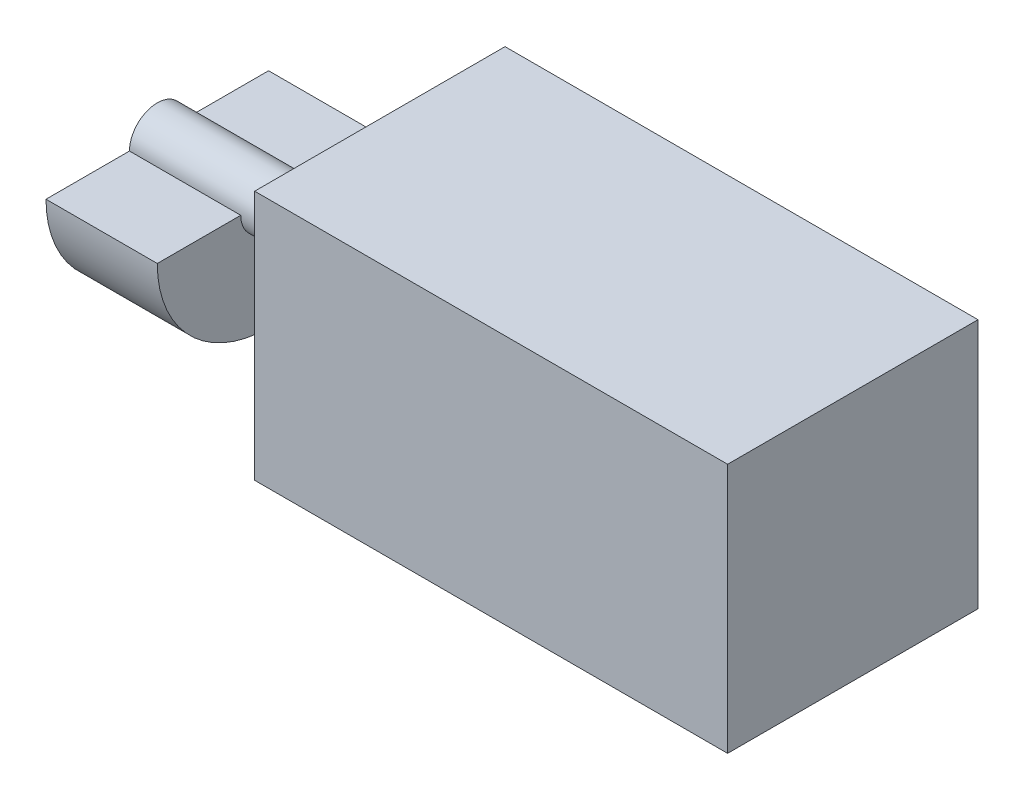
ISO-10303-21;
HEADER;
FILE_DESCRIPTION(('STEP AP214'),'2;1');
FILE_NAME('part.step','',(''),(''),'','','');
FILE_SCHEMA(('AUTOMOTIVE_DESIGN { 1 0 10303 214 1 1 1 1 }'));
ENDSEC;
DATA;
#1=APPLICATION_CONTEXT('core data for automotive mechanical design processes');
#2=APPLICATION_PROTOCOL_DEFINITION('international standard','automotive_design',2000,#1);
#3=PRODUCT_CONTEXT('',#1,'mechanical');
#4=PRODUCT('Part','Part','',(#3));
#5=PRODUCT_RELATED_PRODUCT_CATEGORY('part','',(#4));
#6=PRODUCT_DEFINITION_FORMATION('','',#4);
#7=PRODUCT_DEFINITION_CONTEXT('part definition',#1,'design');
#8=PRODUCT_DEFINITION('design','',#6,#7);
#9=PRODUCT_DEFINITION_SHAPE('','',#8);
#10=(LENGTH_UNIT() NAMED_UNIT(*) SI_UNIT(.MILLI.,.METRE.));
#11=(NAMED_UNIT(*) PLANE_ANGLE_UNIT() SI_UNIT($,.RADIAN.));
#12=(NAMED_UNIT(*) SI_UNIT($,.STERADIAN.) SOLID_ANGLE_UNIT());
#13=UNCERTAINTY_MEASURE_WITH_UNIT(LENGTH_MEASURE(1.E-05),#10,'distance_accuracy_value','');
#14=(GEOMETRIC_REPRESENTATION_CONTEXT(3) GLOBAL_UNCERTAINTY_ASSIGNED_CONTEXT((#13)) GLOBAL_UNIT_ASSIGNED_CONTEXT((#10,
#11,#12)) REPRESENTATION_CONTEXT('',''));
#15=CARTESIAN_POINT('',(0.,0.,0.));
#16=DIRECTION('',(0.,0.,1.));
#17=DIRECTION('',(1.,0.,0.));
#18=AXIS2_PLACEMENT_3D('',#15,#16,#17);
#19=CARTESIAN_POINT('',(-4.25,4.5,-2.25));
#20=DIRECTION('',(1.,0.,0.));
#21=DIRECTION('',(0.,0.,-1.));
#22=AXIS2_PLACEMENT_3D('',#19,#20,#21);
#23=PLANE('',#22);
#24=CARTESIAN_POINT('',(-4.25,2.25,0.));
#25=DIRECTION('',(-1.,0.,0.));
#26=DIRECTION('',(0.,0.,1.));
#27=AXIS2_PLACEMENT_3D('',#24,#25,#26);
#28=CIRCLE('',#27,1.25);
#29=CARTESIAN_POINT('',(-4.25,2.25,1.25));
#30=VERTEX_POINT('',#29);
#31=EDGE_CURVE('E42',#30,#30,#28,.T.);
#32=ORIENTED_EDGE('',*,*,#31,.F.);
#33=EDGE_LOOP('',(#32));
#34=FACE_BOUND('',#33,.T.);
#35=DIRECTION('',(0.,0.,1.));
#36=VECTOR('',#35,1.);
#37=CARTESIAN_POINT('',(-4.25,0.,-2.25));
#38=LINE('',#37,#36);
#39=CARTESIAN_POINT('',(-4.25,0.,-2.25));
#40=VERTEX_POINT('',#39);
#41=CARTESIAN_POINT('',(-4.25,0.,2.25));
#42=VERTEX_POINT('',#41);
#43=EDGE_CURVE('E134',#40,#42,#38,.T.);
#44=ORIENTED_EDGE('',*,*,#43,.T.);
#45=DIRECTION('',(0.,-1.,0.));
#46=VECTOR('',#45,1.);
#47=CARTESIAN_POINT('',(-4.25,4.5,2.25));
#48=LINE('',#47,#46);
#49=CARTESIAN_POINT('',(-4.25,4.5,2.25));
#50=VERTEX_POINT('',#49);
#51=EDGE_CURVE('E37',#50,#42,#48,.T.);
#52=ORIENTED_EDGE('',*,*,#51,.F.);
#53=DIRECTION('',(0.,0.,1.));
#54=VECTOR('',#53,1.);
#55=CARTESIAN_POINT('',(-4.25,4.5,-2.25));
#56=LINE('',#55,#54);
#57=CARTESIAN_POINT('',(-4.25,4.5,-2.25));
#58=VERTEX_POINT('',#57);
#59=EDGE_CURVE('E143',#58,#50,#56,.T.);
#60=ORIENTED_EDGE('',*,*,#59,.F.);
#61=DIRECTION('',(0.,-1.,0.));
#62=VECTOR('',#61,1.);
#63=CARTESIAN_POINT('',(-4.25,4.5,-2.25));
#64=LINE('',#63,#62);
#65=EDGE_CURVE('E149',#58,#40,#64,.T.);
#66=ORIENTED_EDGE('',*,*,#65,.T.);
#67=EDGE_LOOP('',(#44,#52,#60,#66));
#68=FACE_BOUND('',#67,.T.);
#69=ADVANCED_FACE('F34',(#34,#68),#23,.F.);
#70=CARTESIAN_POINT('',(4.25,4.5,2.25));
#71=DIRECTION('',(0.,0.,-1.));
#72=DIRECTION('',(-1.,0.,0.));
#73=AXIS2_PLACEMENT_3D('',#70,#71,#72);
#74=PLANE('',#73);
#75=DIRECTION('',(1.,0.,0.));
#76=VECTOR('',#75,1.);
#77=CARTESIAN_POINT('',(4.25,0.,2.25));
#78=LINE('',#77,#76);
#79=CARTESIAN_POINT('',(4.25,0.,2.25));
#80=VERTEX_POINT('',#79);
#81=EDGE_CURVE('E152',#42,#80,#78,.T.);
#82=ORIENTED_EDGE('',*,*,#81,.T.);
#83=DIRECTION('',(0.,-1.,0.));
#84=VECTOR('',#83,1.);
#85=CARTESIAN_POINT('',(4.25,4.5,2.25));
#86=LINE('',#85,#84);
#87=CARTESIAN_POINT('',(4.25,4.5,2.25));
#88=VERTEX_POINT('',#87);
#89=EDGE_CURVE('E159',#88,#80,#86,.T.);
#90=ORIENTED_EDGE('',*,*,#89,.F.);
#91=DIRECTION('',(1.,0.,0.));
#92=VECTOR('',#91,1.);
#93=CARTESIAN_POINT('',(4.25,4.5,2.25));
#94=LINE('',#93,#92);
#95=EDGE_CURVE('E88',#50,#88,#94,.T.);
#96=ORIENTED_EDGE('',*,*,#95,.F.);
#97=ORIENTED_EDGE('',*,*,#51,.T.);
#98=EDGE_LOOP('',(#82,#90,#96,#97));
#99=FACE_BOUND('',#98,.T.);
#100=ADVANCED_FACE('F165',(#99),#74,.F.);
#101=CARTESIAN_POINT('',(4.25,4.5,-2.25));
#102=DIRECTION('',(-1.,0.,0.));
#103=DIRECTION('',(0.,0.,1.));
#104=AXIS2_PLACEMENT_3D('',#101,#102,#103);
#105=PLANE('',#104);
#106=DIRECTION('',(0.,0.,-1.));
#107=VECTOR('',#106,1.);
#108=CARTESIAN_POINT('',(4.25,0.,-2.25));
#109=LINE('',#108,#107);
#110=CARTESIAN_POINT('',(4.25,0.,-2.25));
#111=VERTEX_POINT('',#110);
#112=EDGE_CURVE('E154',#80,#111,#109,.T.);
#113=ORIENTED_EDGE('',*,*,#112,.T.);
#114=DIRECTION('',(0.,-1.,0.));
#115=VECTOR('',#114,1.);
#116=CARTESIAN_POINT('',(4.25,4.5,-2.25));
#117=LINE('',#116,#115);
#118=CARTESIAN_POINT('',(4.25,4.5,-2.25));
#119=VERTEX_POINT('',#118);
#120=EDGE_CURVE('E158',#119,#111,#117,.T.);
#121=ORIENTED_EDGE('',*,*,#120,.F.);
#122=DIRECTION('',(0.,0.,-1.));
#123=VECTOR('',#122,1.);
#124=CARTESIAN_POINT('',(4.25,4.5,-2.25));
#125=LINE('',#124,#123);
#126=EDGE_CURVE('E146',#88,#119,#125,.T.);
#127=ORIENTED_EDGE('',*,*,#126,.F.);
#128=ORIENTED_EDGE('',*,*,#89,.T.);
#129=EDGE_LOOP('',(#113,#121,#127,#128));
#130=FACE_BOUND('',#129,.T.);
#131=ADVANCED_FACE('F172',(#130),#105,.F.);
#132=CARTESIAN_POINT('',(4.25,4.5,-2.25));
#133=DIRECTION('',(0.,0.,1.));
#134=DIRECTION('',(1.,0.,0.));
#135=AXIS2_PLACEMENT_3D('',#132,#133,#134);
#136=PLANE('',#135);
#137=DIRECTION('',(-1.,0.,0.));
#138=VECTOR('',#137,1.);
#139=CARTESIAN_POINT('',(4.25,0.,-2.25));
#140=LINE('',#139,#138);
#141=EDGE_CURVE('E80',#111,#40,#140,.T.);
#142=ORIENTED_EDGE('',*,*,#141,.T.);
#143=ORIENTED_EDGE('',*,*,#65,.F.);
#144=DIRECTION('',(-1.,0.,0.));
#145=VECTOR('',#144,1.);
#146=CARTESIAN_POINT('',(4.25,4.5,-2.25));
#147=LINE('',#146,#145);
#148=EDGE_CURVE('E59',#119,#58,#147,.T.);
#149=ORIENTED_EDGE('',*,*,#148,.F.);
#150=ORIENTED_EDGE('',*,*,#120,.T.);
#151=EDGE_LOOP('',(#142,#143,#149,#150));
#152=FACE_BOUND('',#151,.T.);
#153=ADVANCED_FACE('F173',(#152),#136,.F.);
#154=CARTESIAN_POINT('',(0.,4.5,0.));
#155=DIRECTION('',(0.,-1.,0.));
#156=DIRECTION('',(0.,0.,-1.));
#157=AXIS2_PLACEMENT_3D('',#154,#155,#156);
#158=PLANE('',#157);
#159=ORIENTED_EDGE('',*,*,#59,.T.);
#160=ORIENTED_EDGE('',*,*,#95,.T.);
#161=ORIENTED_EDGE('',*,*,#126,.T.);
#162=ORIENTED_EDGE('',*,*,#148,.T.);
#163=EDGE_LOOP('',(#159,#160,#161,#162));
#164=FACE_BOUND('',#163,.T.);
#165=ADVANCED_FACE('F174',(#164),#158,.F.);
#166=CARTESIAN_POINT('',(0.,0.,0.));
#167=DIRECTION('',(0.,-1.,0.));
#168=DIRECTION('',(0.,0.,-1.));
#169=AXIS2_PLACEMENT_3D('',#166,#167,#168);
#170=PLANE('',#169);
#171=ORIENTED_EDGE('',*,*,#43,.F.);
#172=ORIENTED_EDGE('',*,*,#141,.F.);
#173=ORIENTED_EDGE('',*,*,#112,.F.);
#174=ORIENTED_EDGE('',*,*,#81,.F.);
#175=EDGE_LOOP('',(#171,#172,#173,#174));
#176=FACE_BOUND('',#175,.T.);
#177=ADVANCED_FACE('F170',(#176),#170,.T.);
#178=CARTESIAN_POINT('',(-5.25,2.25,0.));
#179=DIRECTION('',(1.,0.,0.));
#180=DIRECTION('',(0.,0.,-1.));
#181=AXIS2_PLACEMENT_3D('',#178,#179,#180);
#182=CYLINDRICAL_SURFACE('',#181,1.25);
#183=CARTESIAN_POINT('',(-5.25,2.25,0.));
#184=DIRECTION('',(-1.,0.,0.));
#185=DIRECTION('',(0.,0.,1.));
#186=AXIS2_PLACEMENT_3D('',#183,#184,#185);
#187=CIRCLE('',#186,1.25);
#188=CARTESIAN_POINT('',(-5.25,2.25,1.25));
#189=VERTEX_POINT('',#188);
#190=EDGE_CURVE('E130',#189,#189,#187,.T.);
#191=ORIENTED_EDGE('',*,*,#190,.F.);
#192=EDGE_LOOP('',(#191));
#193=FACE_BOUND('',#192,.T.);
#194=ORIENTED_EDGE('',*,*,#31,.T.);
#195=EDGE_LOOP('',(#194));
#196=FACE_BOUND('',#195,.T.);
#197=ADVANCED_FACE('F181',(#193,#196),#182,.T.);
#198=CARTESIAN_POINT('',(-5.25,2.25,0.));
#199=DIRECTION('',(-1.,0.,0.));
#200=DIRECTION('',(0.,0.,1.));
#201=AXIS2_PLACEMENT_3D('',#198,#199,#200);
#202=PLANE('',#201);
#203=CARTESIAN_POINT('',(-5.25,2.25,0.));
#204=DIRECTION('',(-1.,0.,0.));
#205=DIRECTION('',(0.,0.,1.));
#206=AXIS2_PLACEMENT_3D('',#203,#204,#205);
#207=CIRCLE('',#206,0.5);
#208=CARTESIAN_POINT('',(-5.25,2.25,0.5));
#209=VERTEX_POINT('',#208);
#210=EDGE_CURVE('E11',#209,#209,#207,.T.);
#211=ORIENTED_EDGE('',*,*,#210,.F.);
#212=EDGE_LOOP('',(#211));
#213=FACE_BOUND('',#212,.T.);
#214=ORIENTED_EDGE('',*,*,#190,.T.);
#215=EDGE_LOOP('',(#214));
#216=FACE_BOUND('',#215,.T.);
#217=ADVANCED_FACE('F193',(#213,#216),#202,.T.);
#218=CARTESIAN_POINT('',(-6.25,2.25,0.));
#219=DIRECTION('',(1.,0.,0.));
#220=DIRECTION('',(0.,0.,-1.));
#221=AXIS2_PLACEMENT_3D('',#218,#219,#220);
#222=CYLINDRICAL_SURFACE('',#221,0.5);
#223=CARTESIAN_POINT('',(-6.25,2.25,0.));
#224=DIRECTION('',(-1.,0.,0.));
#225=DIRECTION('',(0.,0.,1.));
#226=AXIS2_PLACEMENT_3D('',#223,#224,#225);
#227=CIRCLE('',#226,0.5);
#228=CARTESIAN_POINT('',(-6.25,2.25,-0.499999999999999));
#229=VERTEX_POINT('',#228);
#230=CARTESIAN_POINT('',(-6.25,2.25,0.500000000000001));
#231=VERTEX_POINT('',#230);
#232=EDGE_CURVE('E115',#229,#231,#227,.T.);
#233=ORIENTED_EDGE('',*,*,#232,.F.);
#234=DIRECTION('',(-1.,0.,0.));
#235=VECTOR('',#234,1.);
#236=CARTESIAN_POINT('',(-6.25,2.25,-0.499999999999999));
#237=LINE('',#236,#235);
#238=CARTESIAN_POINT('',(-8.25,2.25,-0.499999999999999));
#239=VERTEX_POINT('',#238);
#240=EDGE_CURVE('E223',#229,#239,#237,.T.);
#241=ORIENTED_EDGE('',*,*,#240,.T.);
#242=CARTESIAN_POINT('',(-8.25,2.25,0.));
#243=DIRECTION('',(-1.,0.,0.));
#244=DIRECTION('',(0.,0.,1.));
#245=AXIS2_PLACEMENT_3D('',#242,#243,#244);
#246=CIRCLE('',#245,0.5);
#247=CARTESIAN_POINT('',(-8.25,2.25,0.500000000000001));
#248=VERTEX_POINT('',#247);
#249=EDGE_CURVE('E117',#248,#239,#246,.T.);
#250=ORIENTED_EDGE('',*,*,#249,.F.);
#251=DIRECTION('',(-1.,0.,0.));
#252=VECTOR('',#251,1.);
#253=CARTESIAN_POINT('',(-6.25,2.25,0.500000000000001));
#254=LINE('',#253,#252);
#255=EDGE_CURVE('E111',#231,#248,#254,.T.);
#256=ORIENTED_EDGE('',*,*,#255,.F.);
#257=EDGE_LOOP('',(#233,#241,#250,#256));
#258=FACE_BOUND('',#257,.T.);
#259=ORIENTED_EDGE('',*,*,#210,.T.);
#260=EDGE_LOOP('',(#259));
#261=FACE_BOUND('',#260,.T.);
#262=ADVANCED_FACE('F112',(#258,#261),#222,.T.);
#263=CARTESIAN_POINT('',(-8.25,2.25,0.));
#264=DIRECTION('',(1.,0.,0.));
#265=DIRECTION('',(0.,0.,-1.));
#266=AXIS2_PLACEMENT_3D('',#263,#264,#265);
#267=CYLINDRICAL_SURFACE('',#266,2.);
#268=CARTESIAN_POINT('',(-8.25,2.25,0.));
#269=DIRECTION('',(-1.,0.,0.));
#270=DIRECTION('',(0.,0.,1.));
#271=AXIS2_PLACEMENT_3D('',#268,#269,#270);
#272=CIRCLE('',#271,2.);
#273=CARTESIAN_POINT('',(-8.25,2.25,-2.));
#274=VERTEX_POINT('',#273);
#275=CARTESIAN_POINT('',(-8.25,2.25,2.));
#276=VERTEX_POINT('',#275);
#277=EDGE_CURVE('E131',#274,#276,#272,.T.);
#278=ORIENTED_EDGE('',*,*,#277,.F.);
#279=DIRECTION('',(-1.,0.,0.));
#280=VECTOR('',#279,1.);
#281=CARTESIAN_POINT('',(-6.25,2.25,-2.));
#282=LINE('',#281,#280);
#283=CARTESIAN_POINT('',(-6.25,2.25,-2.));
#284=VERTEX_POINT('',#283);
#285=EDGE_CURVE('E225',#284,#274,#282,.T.);
#286=ORIENTED_EDGE('',*,*,#285,.F.);
#287=CARTESIAN_POINT('',(-6.25,2.25,0.));
#288=DIRECTION('',(-1.,0.,0.));
#289=DIRECTION('',(0.,0.,1.));
#290=AXIS2_PLACEMENT_3D('',#287,#288,#289);
#291=CIRCLE('',#290,2.);
#292=CARTESIAN_POINT('',(-6.25,2.25,2.));
#293=VERTEX_POINT('',#292);
#294=EDGE_CURVE('E137',#284,#293,#291,.T.);
#295=ORIENTED_EDGE('',*,*,#294,.T.);
#296=DIRECTION('',(-1.,0.,0.));
#297=VECTOR('',#296,1.);
#298=CARTESIAN_POINT('',(-6.25,2.25,2.));
#299=LINE('',#298,#297);
#300=EDGE_CURVE('E50',#293,#276,#299,.T.);
#301=ORIENTED_EDGE('',*,*,#300,.T.);
#302=EDGE_LOOP('',(#278,#286,#295,#301));
#303=FACE_BOUND('',#302,.T.);
#304=ADVANCED_FACE('F204',(#303),#267,.T.);
#305=CARTESIAN_POINT('',(-8.25,2.25,0.));
#306=DIRECTION('',(-1.,0.,0.));
#307=DIRECTION('',(0.,0.,1.));
#308=AXIS2_PLACEMENT_3D('',#305,#306,#307);
#309=PLANE('',#308);
#310=DIRECTION('',(0.,0.,1.));
#311=VECTOR('',#310,1.);
#312=CARTESIAN_POINT('',(-8.25,2.25,0.));
#313=LINE('',#312,#311);
#314=EDGE_CURVE('E126',#274,#239,#313,.T.);
#315=ORIENTED_EDGE('',*,*,#314,.F.);
#316=ORIENTED_EDGE('',*,*,#277,.T.);
#317=DIRECTION('',(0.,0.,1.));
#318=VECTOR('',#317,1.);
#319=CARTESIAN_POINT('',(-8.25,2.25,0.));
#320=LINE('',#319,#318);
#321=EDGE_CURVE('E227',#248,#276,#320,.T.);
#322=ORIENTED_EDGE('',*,*,#321,.F.);
#323=ORIENTED_EDGE('',*,*,#249,.T.);
#324=EDGE_LOOP('',(#315,#316,#322,#323));
#325=FACE_BOUND('',#324,.T.);
#326=ADVANCED_FACE('F207',(#325),#309,.T.);
#327=CARTESIAN_POINT('',(-6.25,2.25,0.));
#328=DIRECTION('',(-1.,0.,0.));
#329=DIRECTION('',(0.,0.,1.));
#330=AXIS2_PLACEMENT_3D('',#327,#328,#329);
#331=PLANE('',#330);
#332=ORIENTED_EDGE('',*,*,#294,.F.);
#333=DIRECTION('',(0.,0.,1.));
#334=VECTOR('',#333,1.);
#335=CARTESIAN_POINT('',(-6.25,2.25,0.));
#336=LINE('',#335,#334);
#337=EDGE_CURVE('E119',#284,#229,#336,.T.);
#338=ORIENTED_EDGE('',*,*,#337,.T.);
#339=ORIENTED_EDGE('',*,*,#232,.T.);
#340=DIRECTION('',(0.,0.,1.));
#341=VECTOR('',#340,1.);
#342=CARTESIAN_POINT('',(-6.25,2.25,0.));
#343=LINE('',#342,#341);
#344=EDGE_CURVE('E121',#231,#293,#343,.T.);
#345=ORIENTED_EDGE('',*,*,#344,.T.);
#346=EDGE_LOOP('',(#332,#338,#339,#345));
#347=FACE_BOUND('',#346,.T.);
#348=ADVANCED_FACE('F129',(#347),#331,.F.);
#349=CARTESIAN_POINT('',(-6.25,2.25,0.));
#350=DIRECTION('',(0.,-1.,0.));
#351=DIRECTION('',(0.,0.,-1.));
#352=AXIS2_PLACEMENT_3D('',#349,#350,#351);
#353=PLANE('',#352);
#354=ORIENTED_EDGE('',*,*,#314,.T.);
#355=ORIENTED_EDGE('',*,*,#240,.F.);
#356=ORIENTED_EDGE('',*,*,#337,.F.);
#357=ORIENTED_EDGE('',*,*,#285,.T.);
#358=EDGE_LOOP('',(#354,#355,#356,#357));
#359=FACE_BOUND('',#358,.T.);
#360=ADVANCED_FACE('F211',(#359),#353,.F.);
#361=CARTESIAN_POINT('',(-6.25,2.25,0.));
#362=DIRECTION('',(0.,-1.,0.));
#363=DIRECTION('',(0.,0.,-1.));
#364=AXIS2_PLACEMENT_3D('',#361,#362,#363);
#365=PLANE('',#364);
#366=ORIENTED_EDGE('',*,*,#321,.T.);
#367=ORIENTED_EDGE('',*,*,#300,.F.);
#368=ORIENTED_EDGE('',*,*,#344,.F.);
#369=ORIENTED_EDGE('',*,*,#255,.T.);
#370=EDGE_LOOP('',(#366,#367,#368,#369));
#371=FACE_BOUND('',#370,.T.);
#372=ADVANCED_FACE('F122',(#371),#365,.F.);
#373=CLOSED_SHELL('',(#69,#100,#131,#153,#165,#177,#197,#217,#262,#304,#326,#348,#360,#372));
#374=MANIFOLD_SOLID_BREP('B2',#373);
#375=ADVANCED_BREP_SHAPE_REPRESENTATION('',(#18,#374),#14);
#376=SHAPE_DEFINITION_REPRESENTATION(#9,#375);
ENDSEC;
END-ISO-10303-21;
